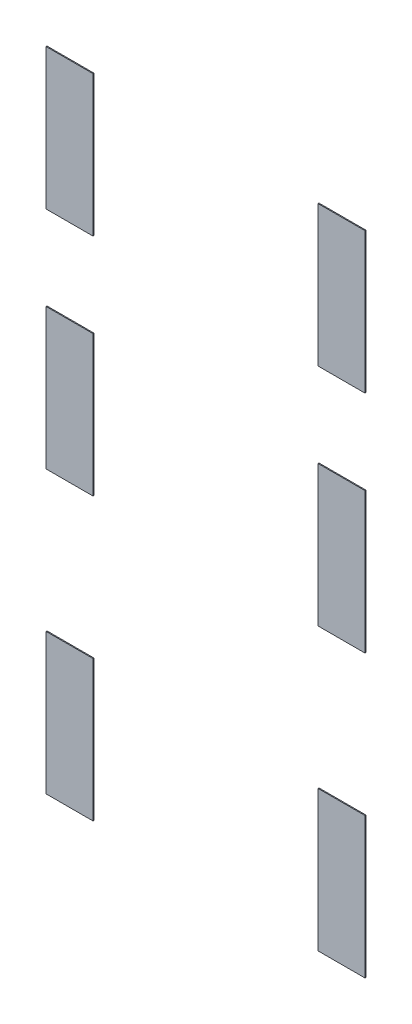
ISO-10303-21;
HEADER;
FILE_DESCRIPTION(('STEP AP214'),'2;1');
FILE_NAME('part.step','',(''),(''),'','','');
FILE_SCHEMA(('AUTOMOTIVE_DESIGN { 1 0 10303 214 1 1 1 1 }'));
ENDSEC;
DATA;
#1=APPLICATION_CONTEXT('core data for automotive mechanical design processes');
#2=APPLICATION_PROTOCOL_DEFINITION('international standard','automotive_design',2000,#1);
#3=PRODUCT_CONTEXT('',#1,'mechanical');
#4=PRODUCT('Part','Part','',(#3));
#5=PRODUCT_RELATED_PRODUCT_CATEGORY('part','',(#4));
#6=PRODUCT_DEFINITION_FORMATION('','',#4);
#7=PRODUCT_DEFINITION_CONTEXT('part definition',#1,'design');
#8=PRODUCT_DEFINITION('design','',#6,#7);
#9=PRODUCT_DEFINITION_SHAPE('','',#8);
#10=(LENGTH_UNIT() NAMED_UNIT(*) SI_UNIT(.MILLI.,.METRE.));
#11=(NAMED_UNIT(*) PLANE_ANGLE_UNIT() SI_UNIT($,.RADIAN.));
#12=(NAMED_UNIT(*) SI_UNIT($,.STERADIAN.) SOLID_ANGLE_UNIT());
#13=UNCERTAINTY_MEASURE_WITH_UNIT(LENGTH_MEASURE(1.E-05),#10,'distance_accuracy_value','');
#14=(GEOMETRIC_REPRESENTATION_CONTEXT(3) GLOBAL_UNCERTAINTY_ASSIGNED_CONTEXT((#13)) GLOBAL_UNIT_ASSIGNED_CONTEXT((#10,
#11,#12)) REPRESENTATION_CONTEXT('',''));
#15=CARTESIAN_POINT('',(0.,0.,0.));
#16=DIRECTION('',(0.,0.,1.));
#17=DIRECTION('',(1.,0.,0.));
#18=AXIS2_PLACEMENT_3D('',#15,#16,#17);
#19=CARTESIAN_POINT('',(241.29,-203.2,-0.01));
#20=DIRECTION('',(0.,-1.,0.));
#21=DIRECTION('',(1.,0.,0.));
#22=AXIS2_PLACEMENT_3D('',#19,#20,#21);
#23=PLANE('',#22);
#24=DIRECTION('',(1.,0.,0.));
#25=VECTOR('',#24,1.);
#26=CARTESIAN_POINT('',(304.8,-203.2,2.54));
#27=LINE('',#26,#25);
#28=CARTESIAN_POINT('',(241.3,-203.2,2.54));
#29=VERTEX_POINT('',#28);
#30=CARTESIAN_POINT('',(368.3,-203.2,2.54));
#31=VERTEX_POINT('',#30);
#32=EDGE_CURVE('P0_E69',#29,#31,#27,.T.);
#33=ORIENTED_EDGE('',*,*,#32,.F.);
#34=DIRECTION('',(0.,0.,1.));
#35=VECTOR('',#34,1.);
#36=CARTESIAN_POINT('',(241.3,-203.2,1.27000000000001));
#37=LINE('',#36,#35);
#38=CARTESIAN_POINT('',(241.3,-203.2,0.));
#39=VERTEX_POINT('',#38);
#40=EDGE_CURVE('P0_E56',#39,#29,#37,.T.);
#41=ORIENTED_EDGE('',*,*,#40,.F.);
#42=DIRECTION('',(-1.,0.,0.));
#43=VECTOR('',#42,1.);
#44=CARTESIAN_POINT('',(304.8,-203.2,0.));
#45=LINE('',#44,#43);
#46=CARTESIAN_POINT('',(368.3,-203.2,0.));
#47=VERTEX_POINT('',#46);
#48=EDGE_CURVE('P0_E21',#47,#39,#45,.T.);
#49=ORIENTED_EDGE('',*,*,#48,.F.);
#50=DIRECTION('',(0.,0.,-1.));
#51=VECTOR('',#50,1.);
#52=CARTESIAN_POINT('',(368.3,-203.2,1.27000000000001));
#53=LINE('',#52,#51);
#54=EDGE_CURVE('P0_E82',#31,#47,#53,.T.);
#55=ORIENTED_EDGE('',*,*,#54,.F.);
#56=EDGE_LOOP('',(#33,#41,#49,#55));
#57=FACE_BOUND('',#56,.T.);
#58=ADVANCED_FACE('P0_F17',(#57),#23,.T.);
#59=CARTESIAN_POINT('',(368.31,-203.21,0.));
#60=DIRECTION('',(0.,0.,-1.));
#61=DIRECTION('',(-1.,0.,0.));
#62=AXIS2_PLACEMENT_3D('',#59,#60,#61);
#63=PLANE('',#62);
#64=DIRECTION('',(0.,1.,0.));
#65=VECTOR('',#64,1.);
#66=CARTESIAN_POINT('',(368.3,-12.7,0.));
#67=LINE('',#66,#65);
#68=CARTESIAN_POINT('',(368.3,177.8,0.));
#69=VERTEX_POINT('',#68);
#70=EDGE_CURVE('P0_E65',#47,#69,#67,.T.);
#71=ORIENTED_EDGE('',*,*,#70,.F.);
#72=ORIENTED_EDGE('',*,*,#48,.T.);
#73=DIRECTION('',(0.,-1.,0.));
#74=VECTOR('',#73,1.);
#75=CARTESIAN_POINT('',(241.3,-12.7,0.));
#76=LINE('',#75,#74);
#77=CARTESIAN_POINT('',(241.3,177.8,0.));
#78=VERTEX_POINT('',#77);
#79=EDGE_CURVE('P0_E62',#78,#39,#76,.T.);
#80=ORIENTED_EDGE('',*,*,#79,.F.);
#81=DIRECTION('',(-1.,0.,0.));
#82=VECTOR('',#81,1.);
#83=CARTESIAN_POINT('',(304.8,177.8,0.));
#84=LINE('',#83,#82);
#85=EDGE_CURVE('P0_E84',#69,#78,#84,.T.);
#86=ORIENTED_EDGE('',*,*,#85,.F.);
#87=EDGE_LOOP('',(#71,#72,#80,#86));
#88=FACE_BOUND('',#87,.T.);
#89=ADVANCED_FACE('P0_F61',(#88),#63,.T.);
#90=CARTESIAN_POINT('',(241.3,177.81,-0.01));
#91=DIRECTION('',(-1.,0.,0.));
#92=DIRECTION('',(0.,-1.,0.));
#93=AXIS2_PLACEMENT_3D('',#90,#91,#92);
#94=PLANE('',#93);
#95=DIRECTION('',(0.,-1.,0.));
#96=VECTOR('',#95,1.);
#97=CARTESIAN_POINT('',(241.3,-12.7,2.54));
#98=LINE('',#97,#96);
#99=CARTESIAN_POINT('',(241.3,177.8,2.54));
#100=VERTEX_POINT('',#99);
#101=EDGE_CURVE('P0_E71',#100,#29,#98,.T.);
#102=ORIENTED_EDGE('',*,*,#101,.F.);
#103=DIRECTION('',(0.,0.,1.));
#104=VECTOR('',#103,1.);
#105=CARTESIAN_POINT('',(241.3,177.8,1.27000000000001));
#106=LINE('',#105,#104);
#107=EDGE_CURVE('P0_E75',#78,#100,#106,.T.);
#108=ORIENTED_EDGE('',*,*,#107,.F.);
#109=ORIENTED_EDGE('',*,*,#79,.T.);
#110=ORIENTED_EDGE('',*,*,#40,.T.);
#111=EDGE_LOOP('',(#102,#108,#109,#110));
#112=FACE_BOUND('',#111,.T.);
#113=ADVANCED_FACE('P0_F73',(#112),#94,.T.);
#114=CARTESIAN_POINT('',(241.29,-203.21,2.54));
#115=DIRECTION('',(0.,0.,1.));
#116=DIRECTION('',(1.,0.,0.));
#117=AXIS2_PLACEMENT_3D('',#114,#115,#116);
#118=PLANE('',#117);
#119=DIRECTION('',(0.,-1.,0.));
#120=VECTOR('',#119,1.);
#121=CARTESIAN_POINT('',(368.3,-12.7,2.54));
#122=LINE('',#121,#120);
#123=CARTESIAN_POINT('',(368.3,177.8,2.54));
#124=VERTEX_POINT('',#123);
#125=EDGE_CURVE('P0_E36',#124,#31,#122,.T.);
#126=ORIENTED_EDGE('',*,*,#125,.F.);
#127=DIRECTION('',(1.,0.,0.));
#128=VECTOR('',#127,1.);
#129=CARTESIAN_POINT('',(304.8,177.8,2.54));
#130=LINE('',#129,#128);
#131=EDGE_CURVE('P0_E27',#100,#124,#130,.T.);
#132=ORIENTED_EDGE('',*,*,#131,.F.);
#133=ORIENTED_EDGE('',*,*,#101,.T.);
#134=ORIENTED_EDGE('',*,*,#32,.T.);
#135=EDGE_LOOP('',(#126,#132,#133,#134));
#136=FACE_BOUND('',#135,.T.);
#137=ADVANCED_FACE('P0_F89',(#136),#118,.T.);
#138=CARTESIAN_POINT('',(368.3,-203.21,-0.01));
#139=DIRECTION('',(1.,0.,0.));
#140=DIRECTION('',(0.,1.,0.));
#141=AXIS2_PLACEMENT_3D('',#138,#139,#140);
#142=PLANE('',#141);
#143=ORIENTED_EDGE('',*,*,#125,.T.);
#144=ORIENTED_EDGE('',*,*,#54,.T.);
#145=ORIENTED_EDGE('',*,*,#70,.T.);
#146=DIRECTION('',(0.,0.,-1.));
#147=VECTOR('',#146,1.);
#148=CARTESIAN_POINT('',(368.3,177.8,1.27000000000001));
#149=LINE('',#148,#147);
#150=EDGE_CURVE('P0_E11',#124,#69,#149,.T.);
#151=ORIENTED_EDGE('',*,*,#150,.F.);
#152=EDGE_LOOP('',(#143,#144,#145,#151));
#153=FACE_BOUND('',#152,.T.);
#154=ADVANCED_FACE('P0_F91',(#153),#142,.T.);
#155=CARTESIAN_POINT('',(368.31,177.8,-0.01));
#156=DIRECTION('',(0.,1.,0.));
#157=DIRECTION('',(-1.,0.,0.));
#158=AXIS2_PLACEMENT_3D('',#155,#156,#157);
#159=PLANE('',#158);
#160=ORIENTED_EDGE('',*,*,#131,.T.);
#161=ORIENTED_EDGE('',*,*,#150,.T.);
#162=ORIENTED_EDGE('',*,*,#85,.T.);
#163=ORIENTED_EDGE('',*,*,#107,.T.);
#164=EDGE_LOOP('',(#160,#161,#162,#163));
#165=FACE_BOUND('',#164,.T.);
#166=ADVANCED_FACE('P0_F19',(#165),#159,.T.);
#167=CLOSED_SHELL('',(#58,#89,#113,#137,#154,#166));
#168=MANIFOLD_SOLID_BREP('P0_B1',#167);
#169=CARTESIAN_POINT('',(-495.3,177.81,-0.01));
#170=DIRECTION('',(-1.,0.,0.));
#171=DIRECTION('',(0.,-1.,0.));
#172=AXIS2_PLACEMENT_3D('',#169,#170,#171);
#173=PLANE('',#172);
#174=DIRECTION('',(0.,-1.,0.));
#175=VECTOR('',#174,1.);
#176=CARTESIAN_POINT('',(-495.3,-12.7000000000002,2.54));
#177=LINE('',#176,#175);
#178=CARTESIAN_POINT('',(-495.3,177.8,2.54));
#179=VERTEX_POINT('',#178);
#180=CARTESIAN_POINT('',(-495.3,-203.2,2.54));
#181=VERTEX_POINT('',#180);
#182=EDGE_CURVE('P1_E69',#179,#181,#177,.T.);
#183=ORIENTED_EDGE('',*,*,#182,.F.);
#184=DIRECTION('',(0.,0.,1.));
#185=VECTOR('',#184,1.);
#186=CARTESIAN_POINT('',(-495.3,177.8,1.27000000000001));
#187=LINE('',#186,#185);
#188=CARTESIAN_POINT('',(-495.3,177.8,0.));
#189=VERTEX_POINT('',#188);
#190=EDGE_CURVE('P1_E56',#189,#179,#187,.T.);
#191=ORIENTED_EDGE('',*,*,#190,.F.);
#192=DIRECTION('',(0.,1.,0.));
#193=VECTOR('',#192,1.);
#194=CARTESIAN_POINT('',(-495.3,-12.7000000000002,0.));
#195=LINE('',#194,#193);
#196=CARTESIAN_POINT('',(-495.3,-203.2,0.));
#197=VERTEX_POINT('',#196);
#198=EDGE_CURVE('P1_E21',#197,#189,#195,.T.);
#199=ORIENTED_EDGE('',*,*,#198,.F.);
#200=DIRECTION('',(0.,0.,-1.));
#201=VECTOR('',#200,1.);
#202=CARTESIAN_POINT('',(-495.3,-203.2,1.27000000000001));
#203=LINE('',#202,#201);
#204=EDGE_CURVE('P1_E82',#181,#197,#203,.T.);
#205=ORIENTED_EDGE('',*,*,#204,.F.);
#206=EDGE_LOOP('',(#183,#191,#199,#205));
#207=FACE_BOUND('',#206,.T.);
#208=ADVANCED_FACE('P1_F17',(#207),#173,.T.);
#209=CARTESIAN_POINT('',(-368.29,-203.21,0.));
#210=DIRECTION('',(0.,0.,-1.));
#211=DIRECTION('',(-1.,0.,0.));
#212=AXIS2_PLACEMENT_3D('',#209,#210,#211);
#213=PLANE('',#212);
#214=DIRECTION('',(1.,0.,0.));
#215=VECTOR('',#214,1.);
#216=CARTESIAN_POINT('',(-431.8,-203.2,0.));
#217=LINE('',#216,#215);
#218=CARTESIAN_POINT('',(-368.3,-203.2,0.));
#219=VERTEX_POINT('',#218);
#220=EDGE_CURVE('P1_E65',#197,#219,#217,.T.);
#221=ORIENTED_EDGE('',*,*,#220,.F.);
#222=ORIENTED_EDGE('',*,*,#198,.T.);
#223=DIRECTION('',(-1.,0.,0.));
#224=VECTOR('',#223,1.);
#225=CARTESIAN_POINT('',(-431.8,177.8,0.));
#226=LINE('',#225,#224);
#227=CARTESIAN_POINT('',(-368.3,177.8,0.));
#228=VERTEX_POINT('',#227);
#229=EDGE_CURVE('P1_E62',#228,#189,#226,.T.);
#230=ORIENTED_EDGE('',*,*,#229,.F.);
#231=DIRECTION('',(0.,1.,0.));
#232=VECTOR('',#231,1.);
#233=CARTESIAN_POINT('',(-368.3,-12.7000000000002,0.));
#234=LINE('',#233,#232);
#235=EDGE_CURVE('P1_E84',#219,#228,#234,.T.);
#236=ORIENTED_EDGE('',*,*,#235,.F.);
#237=EDGE_LOOP('',(#221,#222,#230,#236));
#238=FACE_BOUND('',#237,.T.);
#239=ADVANCED_FACE('P1_F61',(#238),#213,.T.);
#240=CARTESIAN_POINT('',(-368.29,177.8,-0.01));
#241=DIRECTION('',(0.,1.,0.));
#242=DIRECTION('',(-1.,0.,0.));
#243=AXIS2_PLACEMENT_3D('',#240,#241,#242);
#244=PLANE('',#243);
#245=DIRECTION('',(-1.,0.,0.));
#246=VECTOR('',#245,1.);
#247=CARTESIAN_POINT('',(-431.8,177.8,2.54));
#248=LINE('',#247,#246);
#249=CARTESIAN_POINT('',(-368.3,177.8,2.54));
#250=VERTEX_POINT('',#249);
#251=EDGE_CURVE('P1_E71',#250,#179,#248,.T.);
#252=ORIENTED_EDGE('',*,*,#251,.F.);
#253=DIRECTION('',(0.,0.,1.));
#254=VECTOR('',#253,1.);
#255=CARTESIAN_POINT('',(-368.3,177.8,1.27000000000001));
#256=LINE('',#255,#254);
#257=EDGE_CURVE('P1_E75',#228,#250,#256,.T.);
#258=ORIENTED_EDGE('',*,*,#257,.F.);
#259=ORIENTED_EDGE('',*,*,#229,.T.);
#260=ORIENTED_EDGE('',*,*,#190,.T.);
#261=EDGE_LOOP('',(#252,#258,#259,#260));
#262=FACE_BOUND('',#261,.T.);
#263=ADVANCED_FACE('P1_F73',(#262),#244,.T.);
#264=CARTESIAN_POINT('',(-495.31,-203.21,2.54));
#265=DIRECTION('',(0.,0.,1.));
#266=DIRECTION('',(1.,0.,0.));
#267=AXIS2_PLACEMENT_3D('',#264,#265,#266);
#268=PLANE('',#267);
#269=DIRECTION('',(-1.,0.,0.));
#270=VECTOR('',#269,1.);
#271=CARTESIAN_POINT('',(-431.8,-203.2,2.54));
#272=LINE('',#271,#270);
#273=CARTESIAN_POINT('',(-368.3,-203.2,2.54));
#274=VERTEX_POINT('',#273);
#275=EDGE_CURVE('P1_E36',#274,#181,#272,.T.);
#276=ORIENTED_EDGE('',*,*,#275,.F.);
#277=DIRECTION('',(0.,-1.,0.));
#278=VECTOR('',#277,1.);
#279=CARTESIAN_POINT('',(-368.3,-12.7000000000002,2.54));
#280=LINE('',#279,#278);
#281=EDGE_CURVE('P1_E27',#250,#274,#280,.T.);
#282=ORIENTED_EDGE('',*,*,#281,.F.);
#283=ORIENTED_EDGE('',*,*,#251,.T.);
#284=ORIENTED_EDGE('',*,*,#182,.T.);
#285=EDGE_LOOP('',(#276,#282,#283,#284));
#286=FACE_BOUND('',#285,.T.);
#287=ADVANCED_FACE('P1_F89',(#286),#268,.T.);
#288=CARTESIAN_POINT('',(-495.31,-203.2,-0.01));
#289=DIRECTION('',(0.,-1.,0.));
#290=DIRECTION('',(1.,0.,0.));
#291=AXIS2_PLACEMENT_3D('',#288,#289,#290);
#292=PLANE('',#291);
#293=ORIENTED_EDGE('',*,*,#275,.T.);
#294=ORIENTED_EDGE('',*,*,#204,.T.);
#295=ORIENTED_EDGE('',*,*,#220,.T.);
#296=DIRECTION('',(0.,0.,-1.));
#297=VECTOR('',#296,1.);
#298=CARTESIAN_POINT('',(-368.3,-203.2,1.27000000000001));
#299=LINE('',#298,#297);
#300=EDGE_CURVE('P1_E11',#274,#219,#299,.T.);
#301=ORIENTED_EDGE('',*,*,#300,.F.);
#302=EDGE_LOOP('',(#293,#294,#295,#301));
#303=FACE_BOUND('',#302,.T.);
#304=ADVANCED_FACE('P1_F91',(#303),#292,.T.);
#305=CARTESIAN_POINT('',(-368.3,-203.21,-0.01));
#306=DIRECTION('',(1.,0.,0.));
#307=DIRECTION('',(0.,1.,0.));
#308=AXIS2_PLACEMENT_3D('',#305,#306,#307);
#309=PLANE('',#308);
#310=ORIENTED_EDGE('',*,*,#281,.T.);
#311=ORIENTED_EDGE('',*,*,#300,.T.);
#312=ORIENTED_EDGE('',*,*,#235,.T.);
#313=ORIENTED_EDGE('',*,*,#257,.T.);
#314=EDGE_LOOP('',(#310,#311,#312,#313));
#315=FACE_BOUND('',#314,.T.);
#316=ADVANCED_FACE('P1_F19',(#315),#309,.T.);
#317=CLOSED_SHELL('',(#208,#239,#263,#287,#304,#316));
#318=MANIFOLD_SOLID_BREP('P1_B1',#317);
#319=CARTESIAN_POINT('',(241.29,-965.2,-0.01));
#320=DIRECTION('',(0.,-1.,0.));
#321=DIRECTION('',(1.,0.,0.));
#322=AXIS2_PLACEMENT_3D('',#319,#320,#321);
#323=PLANE('',#322);
#324=DIRECTION('',(1.,0.,0.));
#325=VECTOR('',#324,1.);
#326=CARTESIAN_POINT('',(304.8,-965.2,2.54));
#327=LINE('',#326,#325);
#328=CARTESIAN_POINT('',(241.3,-965.2,2.54));
#329=VERTEX_POINT('',#328);
#330=CARTESIAN_POINT('',(368.3,-965.2,2.54));
#331=VERTEX_POINT('',#330);
#332=EDGE_CURVE('P2_E69',#329,#331,#327,.T.);
#333=ORIENTED_EDGE('',*,*,#332,.F.);
#334=DIRECTION('',(0.,0.,1.));
#335=VECTOR('',#334,1.);
#336=CARTESIAN_POINT('',(241.3,-965.2,1.27000000000001));
#337=LINE('',#336,#335);
#338=CARTESIAN_POINT('',(241.3,-965.2,0.));
#339=VERTEX_POINT('',#338);
#340=EDGE_CURVE('P2_E56',#339,#329,#337,.T.);
#341=ORIENTED_EDGE('',*,*,#340,.F.);
#342=DIRECTION('',(-1.,0.,0.));
#343=VECTOR('',#342,1.);
#344=CARTESIAN_POINT('',(304.8,-965.2,0.));
#345=LINE('',#344,#343);
#346=CARTESIAN_POINT('',(368.3,-965.2,0.));
#347=VERTEX_POINT('',#346);
#348=EDGE_CURVE('P2_E21',#347,#339,#345,.T.);
#349=ORIENTED_EDGE('',*,*,#348,.F.);
#350=DIRECTION('',(0.,0.,-1.));
#351=VECTOR('',#350,1.);
#352=CARTESIAN_POINT('',(368.3,-965.2,1.27000000000001));
#353=LINE('',#352,#351);
#354=EDGE_CURVE('P2_E82',#331,#347,#353,.T.);
#355=ORIENTED_EDGE('',*,*,#354,.F.);
#356=EDGE_LOOP('',(#333,#341,#349,#355));
#357=FACE_BOUND('',#356,.T.);
#358=ADVANCED_FACE('P2_F17',(#357),#323,.T.);
#359=CARTESIAN_POINT('',(368.31,-965.21,0.));
#360=DIRECTION('',(0.,0.,-1.));
#361=DIRECTION('',(-1.,0.,0.));
#362=AXIS2_PLACEMENT_3D('',#359,#360,#361);
#363=PLANE('',#362);
#364=DIRECTION('',(0.,1.,0.));
#365=VECTOR('',#364,1.);
#366=CARTESIAN_POINT('',(368.3,-774.7,0.));
#367=LINE('',#366,#365);
#368=CARTESIAN_POINT('',(368.3,-584.2,0.));
#369=VERTEX_POINT('',#368);
#370=EDGE_CURVE('P2_E65',#347,#369,#367,.T.);
#371=ORIENTED_EDGE('',*,*,#370,.F.);
#372=ORIENTED_EDGE('',*,*,#348,.T.);
#373=DIRECTION('',(0.,-1.,0.));
#374=VECTOR('',#373,1.);
#375=CARTESIAN_POINT('',(241.3,-774.7,0.));
#376=LINE('',#375,#374);
#377=CARTESIAN_POINT('',(241.3,-584.2,0.));
#378=VERTEX_POINT('',#377);
#379=EDGE_CURVE('P2_E62',#378,#339,#376,.T.);
#380=ORIENTED_EDGE('',*,*,#379,.F.);
#381=DIRECTION('',(-1.,0.,0.));
#382=VECTOR('',#381,1.);
#383=CARTESIAN_POINT('',(304.8,-584.2,0.));
#384=LINE('',#383,#382);
#385=EDGE_CURVE('P2_E84',#369,#378,#384,.T.);
#386=ORIENTED_EDGE('',*,*,#385,.F.);
#387=EDGE_LOOP('',(#371,#372,#380,#386));
#388=FACE_BOUND('',#387,.T.);
#389=ADVANCED_FACE('P2_F61',(#388),#363,.T.);
#390=CARTESIAN_POINT('',(241.3,-584.19,-0.01));
#391=DIRECTION('',(-1.,0.,0.));
#392=DIRECTION('',(0.,-1.,0.));
#393=AXIS2_PLACEMENT_3D('',#390,#391,#392);
#394=PLANE('',#393);
#395=DIRECTION('',(0.,-1.,0.));
#396=VECTOR('',#395,1.);
#397=CARTESIAN_POINT('',(241.3,-774.7,2.54));
#398=LINE('',#397,#396);
#399=CARTESIAN_POINT('',(241.3,-584.2,2.54));
#400=VERTEX_POINT('',#399);
#401=EDGE_CURVE('P2_E71',#400,#329,#398,.T.);
#402=ORIENTED_EDGE('',*,*,#401,.F.);
#403=DIRECTION('',(0.,0.,1.));
#404=VECTOR('',#403,1.);
#405=CARTESIAN_POINT('',(241.3,-584.2,1.27000000000001));
#406=LINE('',#405,#404);
#407=EDGE_CURVE('P2_E75',#378,#400,#406,.T.);
#408=ORIENTED_EDGE('',*,*,#407,.F.);
#409=ORIENTED_EDGE('',*,*,#379,.T.);
#410=ORIENTED_EDGE('',*,*,#340,.T.);
#411=EDGE_LOOP('',(#402,#408,#409,#410));
#412=FACE_BOUND('',#411,.T.);
#413=ADVANCED_FACE('P2_F73',(#412),#394,.T.);
#414=CARTESIAN_POINT('',(241.29,-965.21,2.54));
#415=DIRECTION('',(0.,0.,1.));
#416=DIRECTION('',(1.,0.,0.));
#417=AXIS2_PLACEMENT_3D('',#414,#415,#416);
#418=PLANE('',#417);
#419=DIRECTION('',(0.,-1.,0.));
#420=VECTOR('',#419,1.);
#421=CARTESIAN_POINT('',(368.3,-774.7,2.54));
#422=LINE('',#421,#420);
#423=CARTESIAN_POINT('',(368.3,-584.2,2.54));
#424=VERTEX_POINT('',#423);
#425=EDGE_CURVE('P2_E36',#424,#331,#422,.T.);
#426=ORIENTED_EDGE('',*,*,#425,.F.);
#427=DIRECTION('',(1.,0.,0.));
#428=VECTOR('',#427,1.);
#429=CARTESIAN_POINT('',(304.8,-584.2,2.54));
#430=LINE('',#429,#428);
#431=EDGE_CURVE('P2_E27',#400,#424,#430,.T.);
#432=ORIENTED_EDGE('',*,*,#431,.F.);
#433=ORIENTED_EDGE('',*,*,#401,.T.);
#434=ORIENTED_EDGE('',*,*,#332,.T.);
#435=EDGE_LOOP('',(#426,#432,#433,#434));
#436=FACE_BOUND('',#435,.T.);
#437=ADVANCED_FACE('P2_F89',(#436),#418,.T.);
#438=CARTESIAN_POINT('',(368.3,-965.21,-0.01));
#439=DIRECTION('',(1.,0.,0.));
#440=DIRECTION('',(0.,1.,0.));
#441=AXIS2_PLACEMENT_3D('',#438,#439,#440);
#442=PLANE('',#441);
#443=ORIENTED_EDGE('',*,*,#425,.T.);
#444=ORIENTED_EDGE('',*,*,#354,.T.);
#445=ORIENTED_EDGE('',*,*,#370,.T.);
#446=DIRECTION('',(0.,0.,-1.));
#447=VECTOR('',#446,1.);
#448=CARTESIAN_POINT('',(368.3,-584.2,1.27000000000001));
#449=LINE('',#448,#447);
#450=EDGE_CURVE('P2_E11',#424,#369,#449,.T.);
#451=ORIENTED_EDGE('',*,*,#450,.F.);
#452=EDGE_LOOP('',(#443,#444,#445,#451));
#453=FACE_BOUND('',#452,.T.);
#454=ADVANCED_FACE('P2_F91',(#453),#442,.T.);
#455=CARTESIAN_POINT('',(368.31,-584.2,-0.01));
#456=DIRECTION('',(0.,1.,0.));
#457=DIRECTION('',(-1.,0.,0.));
#458=AXIS2_PLACEMENT_3D('',#455,#456,#457);
#459=PLANE('',#458);
#460=ORIENTED_EDGE('',*,*,#431,.T.);
#461=ORIENTED_EDGE('',*,*,#450,.T.);
#462=ORIENTED_EDGE('',*,*,#385,.T.);
#463=ORIENTED_EDGE('',*,*,#407,.T.);
#464=EDGE_LOOP('',(#460,#461,#462,#463));
#465=FACE_BOUND('',#464,.T.);
#466=ADVANCED_FACE('P2_F19',(#465),#459,.T.);
#467=CLOSED_SHELL('',(#358,#389,#413,#437,#454,#466));
#468=MANIFOLD_SOLID_BREP('P2_B1',#467);
#469=CARTESIAN_POINT('',(241.29,406.4,-0.01));
#470=DIRECTION('',(0.,-1.,0.));
#471=DIRECTION('',(1.,0.,0.));
#472=AXIS2_PLACEMENT_3D('',#469,#470,#471);
#473=PLANE('',#472);
#474=DIRECTION('',(1.,0.,0.));
#475=VECTOR('',#474,1.);
#476=CARTESIAN_POINT('',(304.8,406.4,2.54));
#477=LINE('',#476,#475);
#478=CARTESIAN_POINT('',(241.3,406.4,2.54));
#479=VERTEX_POINT('',#478);
#480=CARTESIAN_POINT('',(368.3,406.4,2.54));
#481=VERTEX_POINT('',#480);
#482=EDGE_CURVE('P3_E68',#479,#481,#477,.T.);
#483=ORIENTED_EDGE('',*,*,#482,.F.);
#484=DIRECTION('',(0.,0.,1.));
#485=VECTOR('',#484,1.);
#486=CARTESIAN_POINT('',(241.3,406.4,1.27000000000001));
#487=LINE('',#486,#485);
#488=CARTESIAN_POINT('',(241.3,406.4,0.));
#489=VERTEX_POINT('',#488);
#490=EDGE_CURVE('P3_E55',#489,#479,#487,.T.);
#491=ORIENTED_EDGE('',*,*,#490,.F.);
#492=DIRECTION('',(-1.,0.,0.));
#493=VECTOR('',#492,1.);
#494=CARTESIAN_POINT('',(304.8,406.4,0.));
#495=LINE('',#494,#493);
#496=CARTESIAN_POINT('',(368.3,406.4,0.));
#497=VERTEX_POINT('',#496);
#498=EDGE_CURVE('P3_E20',#497,#489,#495,.T.);
#499=ORIENTED_EDGE('',*,*,#498,.F.);
#500=DIRECTION('',(0.,0.,-1.));
#501=VECTOR('',#500,1.);
#502=CARTESIAN_POINT('',(368.3,406.4,1.27000000000001));
#503=LINE('',#502,#501);
#504=EDGE_CURVE('P3_E81',#481,#497,#503,.T.);
#505=ORIENTED_EDGE('',*,*,#504,.F.);
#506=EDGE_LOOP('',(#483,#491,#499,#505));
#507=FACE_BOUND('',#506,.T.);
#508=ADVANCED_FACE('P3_F16',(#507),#473,.T.);
#509=CARTESIAN_POINT('',(368.31,406.39,0.));
#510=DIRECTION('',(0.,0.,-1.));
#511=DIRECTION('',(-1.,0.,0.));
#512=AXIS2_PLACEMENT_3D('',#509,#510,#511);
#513=PLANE('',#512);
#514=DIRECTION('',(0.,1.,0.));
#515=VECTOR('',#514,1.);
#516=CARTESIAN_POINT('',(368.3,596.9,0.));
#517=LINE('',#516,#515);
#518=CARTESIAN_POINT('',(368.3,787.4,0.));
#519=VERTEX_POINT('',#518);
#520=EDGE_CURVE('P3_E64',#497,#519,#517,.T.);
#521=ORIENTED_EDGE('',*,*,#520,.F.);
#522=ORIENTED_EDGE('',*,*,#498,.T.);
#523=DIRECTION('',(0.,-1.,0.));
#524=VECTOR('',#523,1.);
#525=CARTESIAN_POINT('',(241.3,596.9,0.));
#526=LINE('',#525,#524);
#527=CARTESIAN_POINT('',(241.3,787.4,0.));
#528=VERTEX_POINT('',#527);
#529=EDGE_CURVE('P3_E61',#528,#489,#526,.T.);
#530=ORIENTED_EDGE('',*,*,#529,.F.);
#531=DIRECTION('',(-1.,0.,0.));
#532=VECTOR('',#531,1.);
#533=CARTESIAN_POINT('',(304.8,787.4,0.));
#534=LINE('',#533,#532);
#535=EDGE_CURVE('P3_E83',#519,#528,#534,.T.);
#536=ORIENTED_EDGE('',*,*,#535,.F.);
#537=EDGE_LOOP('',(#521,#522,#530,#536));
#538=FACE_BOUND('',#537,.T.);
#539=ADVANCED_FACE('P3_F60',(#538),#513,.T.);
#540=CARTESIAN_POINT('',(241.3,787.41,-0.01));
#541=DIRECTION('',(-1.,0.,0.));
#542=DIRECTION('',(0.,-1.,0.));
#543=AXIS2_PLACEMENT_3D('',#540,#541,#542);
#544=PLANE('',#543);
#545=DIRECTION('',(0.,-1.,0.));
#546=VECTOR('',#545,1.);
#547=CARTESIAN_POINT('',(241.3,596.9,2.54));
#548=LINE('',#547,#546);
#549=CARTESIAN_POINT('',(241.3,787.4,2.54));
#550=VERTEX_POINT('',#549);
#551=EDGE_CURVE('P3_E70',#550,#479,#548,.T.);
#552=ORIENTED_EDGE('',*,*,#551,.F.);
#553=DIRECTION('',(0.,0.,1.));
#554=VECTOR('',#553,1.);
#555=CARTESIAN_POINT('',(241.3,787.4,1.27000000000001));
#556=LINE('',#555,#554);
#557=EDGE_CURVE('P3_E74',#528,#550,#556,.T.);
#558=ORIENTED_EDGE('',*,*,#557,.F.);
#559=ORIENTED_EDGE('',*,*,#529,.T.);
#560=ORIENTED_EDGE('',*,*,#490,.T.);
#561=EDGE_LOOP('',(#552,#558,#559,#560));
#562=FACE_BOUND('',#561,.T.);
#563=ADVANCED_FACE('P3_F72',(#562),#544,.T.);
#564=CARTESIAN_POINT('',(241.29,406.39,2.54));
#565=DIRECTION('',(0.,0.,1.));
#566=DIRECTION('',(1.,0.,0.));
#567=AXIS2_PLACEMENT_3D('',#564,#565,#566);
#568=PLANE('',#567);
#569=DIRECTION('',(0.,-1.,0.));
#570=VECTOR('',#569,1.);
#571=CARTESIAN_POINT('',(368.3,596.9,2.54));
#572=LINE('',#571,#570);
#573=CARTESIAN_POINT('',(368.3,787.4,2.54));
#574=VERTEX_POINT('',#573);
#575=EDGE_CURVE('P3_E35',#574,#481,#572,.T.);
#576=ORIENTED_EDGE('',*,*,#575,.F.);
#577=DIRECTION('',(1.,0.,0.));
#578=VECTOR('',#577,1.);
#579=CARTESIAN_POINT('',(304.8,787.4,2.54));
#580=LINE('',#579,#578);
#581=EDGE_CURVE('P3_E26',#550,#574,#580,.T.);
#582=ORIENTED_EDGE('',*,*,#581,.F.);
#583=ORIENTED_EDGE('',*,*,#551,.T.);
#584=ORIENTED_EDGE('',*,*,#482,.T.);
#585=EDGE_LOOP('',(#576,#582,#583,#584));
#586=FACE_BOUND('',#585,.T.);
#587=ADVANCED_FACE('P3_F88',(#586),#568,.T.);
#588=CARTESIAN_POINT('',(368.3,406.39,-0.01));
#589=DIRECTION('',(1.,0.,0.));
#590=DIRECTION('',(0.,1.,0.));
#591=AXIS2_PLACEMENT_3D('',#588,#589,#590);
#592=PLANE('',#591);
#593=ORIENTED_EDGE('',*,*,#575,.T.);
#594=ORIENTED_EDGE('',*,*,#504,.T.);
#595=ORIENTED_EDGE('',*,*,#520,.T.);
#596=DIRECTION('',(0.,0.,-1.));
#597=VECTOR('',#596,1.);
#598=CARTESIAN_POINT('',(368.3,787.4,1.27000000000001));
#599=LINE('',#598,#597);
#600=EDGE_CURVE('P3_E10',#574,#519,#599,.T.);
#601=ORIENTED_EDGE('',*,*,#600,.F.);
#602=EDGE_LOOP('',(#593,#594,#595,#601));
#603=FACE_BOUND('',#602,.T.);
#604=ADVANCED_FACE('P3_F90',(#603),#592,.T.);
#605=CARTESIAN_POINT('',(368.31,787.4,-0.01));
#606=DIRECTION('',(0.,1.,0.));
#607=DIRECTION('',(-1.,0.,0.));
#608=AXIS2_PLACEMENT_3D('',#605,#606,#607);
#609=PLANE('',#608);
#610=ORIENTED_EDGE('',*,*,#581,.T.);
#611=ORIENTED_EDGE('',*,*,#600,.T.);
#612=ORIENTED_EDGE('',*,*,#535,.T.);
#613=ORIENTED_EDGE('',*,*,#557,.T.);
#614=EDGE_LOOP('',(#610,#611,#612,#613));
#615=FACE_BOUND('',#614,.T.);
#616=ADVANCED_FACE('P3_F18',(#615),#609,.T.);
#617=CLOSED_SHELL('',(#508,#539,#563,#587,#604,#616));
#618=MANIFOLD_SOLID_BREP('P3_B1',#617);
#619=CARTESIAN_POINT('',(-495.3,787.41,-0.01));
#620=DIRECTION('',(-1.,0.,0.));
#621=DIRECTION('',(0.,-1.,0.));
#622=AXIS2_PLACEMENT_3D('',#619,#620,#621);
#623=PLANE('',#622);
#624=DIRECTION('',(0.,-1.,0.));
#625=VECTOR('',#624,1.);
#626=CARTESIAN_POINT('',(-495.3,596.9,2.54));
#627=LINE('',#626,#625);
#628=CARTESIAN_POINT('',(-495.3,787.4,2.54));
#629=VERTEX_POINT('',#628);
#630=CARTESIAN_POINT('',(-495.3,406.4,2.54));
#631=VERTEX_POINT('',#630);
#632=EDGE_CURVE('P4_E69',#629,#631,#627,.T.);
#633=ORIENTED_EDGE('',*,*,#632,.F.);
#634=DIRECTION('',(0.,0.,1.));
#635=VECTOR('',#634,1.);
#636=CARTESIAN_POINT('',(-495.3,787.4,1.27000000000001));
#637=LINE('',#636,#635);
#638=CARTESIAN_POINT('',(-495.3,787.4,0.));
#639=VERTEX_POINT('',#638);
#640=EDGE_CURVE('P4_E56',#639,#629,#637,.T.);
#641=ORIENTED_EDGE('',*,*,#640,.F.);
#642=DIRECTION('',(0.,1.,0.));
#643=VECTOR('',#642,1.);
#644=CARTESIAN_POINT('',(-495.3,596.9,0.));
#645=LINE('',#644,#643);
#646=CARTESIAN_POINT('',(-495.3,406.4,0.));
#647=VERTEX_POINT('',#646);
#648=EDGE_CURVE('P4_E21',#647,#639,#645,.T.);
#649=ORIENTED_EDGE('',*,*,#648,.F.);
#650=DIRECTION('',(0.,0.,-1.));
#651=VECTOR('',#650,1.);
#652=CARTESIAN_POINT('',(-495.3,406.4,1.27000000000001));
#653=LINE('',#652,#651);
#654=EDGE_CURVE('P4_E82',#631,#647,#653,.T.);
#655=ORIENTED_EDGE('',*,*,#654,.F.);
#656=EDGE_LOOP('',(#633,#641,#649,#655));
#657=FACE_BOUND('',#656,.T.);
#658=ADVANCED_FACE('P4_F17',(#657),#623,.T.);
#659=CARTESIAN_POINT('',(-368.29,406.39,0.));
#660=DIRECTION('',(0.,0.,-1.));
#661=DIRECTION('',(-1.,0.,0.));
#662=AXIS2_PLACEMENT_3D('',#659,#660,#661);
#663=PLANE('',#662);
#664=DIRECTION('',(1.,0.,0.));
#665=VECTOR('',#664,1.);
#666=CARTESIAN_POINT('',(-431.8,406.4,0.));
#667=LINE('',#666,#665);
#668=CARTESIAN_POINT('',(-368.3,406.4,0.));
#669=VERTEX_POINT('',#668);
#670=EDGE_CURVE('P4_E65',#647,#669,#667,.T.);
#671=ORIENTED_EDGE('',*,*,#670,.F.);
#672=ORIENTED_EDGE('',*,*,#648,.T.);
#673=DIRECTION('',(-1.,0.,0.));
#674=VECTOR('',#673,1.);
#675=CARTESIAN_POINT('',(-431.8,787.4,0.));
#676=LINE('',#675,#674);
#677=CARTESIAN_POINT('',(-368.3,787.4,0.));
#678=VERTEX_POINT('',#677);
#679=EDGE_CURVE('P4_E62',#678,#639,#676,.T.);
#680=ORIENTED_EDGE('',*,*,#679,.F.);
#681=DIRECTION('',(0.,1.,0.));
#682=VECTOR('',#681,1.);
#683=CARTESIAN_POINT('',(-368.3,596.9,0.));
#684=LINE('',#683,#682);
#685=EDGE_CURVE('P4_E84',#669,#678,#684,.T.);
#686=ORIENTED_EDGE('',*,*,#685,.F.);
#687=EDGE_LOOP('',(#671,#672,#680,#686));
#688=FACE_BOUND('',#687,.T.);
#689=ADVANCED_FACE('P4_F61',(#688),#663,.T.);
#690=CARTESIAN_POINT('',(-368.29,787.4,-0.01));
#691=DIRECTION('',(0.,1.,0.));
#692=DIRECTION('',(-1.,0.,0.));
#693=AXIS2_PLACEMENT_3D('',#690,#691,#692);
#694=PLANE('',#693);
#695=DIRECTION('',(-1.,0.,0.));
#696=VECTOR('',#695,1.);
#697=CARTESIAN_POINT('',(-431.8,787.4,2.54));
#698=LINE('',#697,#696);
#699=CARTESIAN_POINT('',(-368.3,787.4,2.54));
#700=VERTEX_POINT('',#699);
#701=EDGE_CURVE('P4_E71',#700,#629,#698,.T.);
#702=ORIENTED_EDGE('',*,*,#701,.F.);
#703=DIRECTION('',(0.,0.,1.));
#704=VECTOR('',#703,1.);
#705=CARTESIAN_POINT('',(-368.3,787.4,1.27000000000001));
#706=LINE('',#705,#704);
#707=EDGE_CURVE('P4_E75',#678,#700,#706,.T.);
#708=ORIENTED_EDGE('',*,*,#707,.F.);
#709=ORIENTED_EDGE('',*,*,#679,.T.);
#710=ORIENTED_EDGE('',*,*,#640,.T.);
#711=EDGE_LOOP('',(#702,#708,#709,#710));
#712=FACE_BOUND('',#711,.T.);
#713=ADVANCED_FACE('P4_F73',(#712),#694,.T.);
#714=CARTESIAN_POINT('',(-495.31,406.39,2.54));
#715=DIRECTION('',(0.,0.,1.));
#716=DIRECTION('',(1.,0.,0.));
#717=AXIS2_PLACEMENT_3D('',#714,#715,#716);
#718=PLANE('',#717);
#719=DIRECTION('',(-1.,0.,0.));
#720=VECTOR('',#719,1.);
#721=CARTESIAN_POINT('',(-431.8,406.4,2.54));
#722=LINE('',#721,#720);
#723=CARTESIAN_POINT('',(-368.3,406.4,2.54));
#724=VERTEX_POINT('',#723);
#725=EDGE_CURVE('P4_E36',#724,#631,#722,.T.);
#726=ORIENTED_EDGE('',*,*,#725,.F.);
#727=DIRECTION('',(0.,-1.,0.));
#728=VECTOR('',#727,1.);
#729=CARTESIAN_POINT('',(-368.3,596.9,2.54));
#730=LINE('',#729,#728);
#731=EDGE_CURVE('P4_E27',#700,#724,#730,.T.);
#732=ORIENTED_EDGE('',*,*,#731,.F.);
#733=ORIENTED_EDGE('',*,*,#701,.T.);
#734=ORIENTED_EDGE('',*,*,#632,.T.);
#735=EDGE_LOOP('',(#726,#732,#733,#734));
#736=FACE_BOUND('',#735,.T.);
#737=ADVANCED_FACE('P4_F89',(#736),#718,.T.);
#738=CARTESIAN_POINT('',(-495.31,406.4,-0.01));
#739=DIRECTION('',(0.,-1.,0.));
#740=DIRECTION('',(1.,0.,0.));
#741=AXIS2_PLACEMENT_3D('',#738,#739,#740);
#742=PLANE('',#741);
#743=ORIENTED_EDGE('',*,*,#725,.T.);
#744=ORIENTED_EDGE('',*,*,#654,.T.);
#745=ORIENTED_EDGE('',*,*,#670,.T.);
#746=DIRECTION('',(0.,0.,-1.));
#747=VECTOR('',#746,1.);
#748=CARTESIAN_POINT('',(-368.3,406.4,1.27000000000001));
#749=LINE('',#748,#747);
#750=EDGE_CURVE('P4_E11',#724,#669,#749,.T.);
#751=ORIENTED_EDGE('',*,*,#750,.F.);
#752=EDGE_LOOP('',(#743,#744,#745,#751));
#753=FACE_BOUND('',#752,.T.);
#754=ADVANCED_FACE('P4_F91',(#753),#742,.T.);
#755=CARTESIAN_POINT('',(-368.3,406.39,-0.01));
#756=DIRECTION('',(1.,0.,0.));
#757=DIRECTION('',(0.,1.,0.));
#758=AXIS2_PLACEMENT_3D('',#755,#756,#757);
#759=PLANE('',#758);
#760=ORIENTED_EDGE('',*,*,#731,.T.);
#761=ORIENTED_EDGE('',*,*,#750,.T.);
#762=ORIENTED_EDGE('',*,*,#685,.T.);
#763=ORIENTED_EDGE('',*,*,#707,.T.);
#764=EDGE_LOOP('',(#760,#761,#762,#763));
#765=FACE_BOUND('',#764,.T.);
#766=ADVANCED_FACE('P4_F19',(#765),#759,.T.);
#767=CLOSED_SHELL('',(#658,#689,#713,#737,#754,#766));
#768=MANIFOLD_SOLID_BREP('P4_B1',#767);
#769=CARTESIAN_POINT('',(-495.3,-584.19,-0.01));
#770=DIRECTION('',(-1.,0.,0.));
#771=DIRECTION('',(0.,-1.,0.));
#772=AXIS2_PLACEMENT_3D('',#769,#770,#771);
#773=PLANE('',#772);
#774=DIRECTION('',(0.,-1.,0.));
#775=VECTOR('',#774,1.);
#776=CARTESIAN_POINT('',(-495.3,-774.7,2.54));
#777=LINE('',#776,#775);
#778=CARTESIAN_POINT('',(-495.3,-584.2,2.54));
#779=VERTEX_POINT('',#778);
#780=CARTESIAN_POINT('',(-495.3,-965.2,2.54));
#781=VERTEX_POINT('',#780);
#782=EDGE_CURVE('P5_E69',#779,#781,#777,.T.);
#783=ORIENTED_EDGE('',*,*,#782,.F.);
#784=DIRECTION('',(0.,0.,1.));
#785=VECTOR('',#784,1.);
#786=CARTESIAN_POINT('',(-495.3,-584.2,1.27000000000001));
#787=LINE('',#786,#785);
#788=CARTESIAN_POINT('',(-495.3,-584.2,0.));
#789=VERTEX_POINT('',#788);
#790=EDGE_CURVE('P5_E56',#789,#779,#787,.T.);
#791=ORIENTED_EDGE('',*,*,#790,.F.);
#792=DIRECTION('',(0.,1.,0.));
#793=VECTOR('',#792,1.);
#794=CARTESIAN_POINT('',(-495.3,-774.7,0.));
#795=LINE('',#794,#793);
#796=CARTESIAN_POINT('',(-495.3,-965.2,0.));
#797=VERTEX_POINT('',#796);
#798=EDGE_CURVE('P5_E21',#797,#789,#795,.T.);
#799=ORIENTED_EDGE('',*,*,#798,.F.);
#800=DIRECTION('',(0.,0.,-1.));
#801=VECTOR('',#800,1.);
#802=CARTESIAN_POINT('',(-495.3,-965.2,1.27000000000001));
#803=LINE('',#802,#801);
#804=EDGE_CURVE('P5_E82',#781,#797,#803,.T.);
#805=ORIENTED_EDGE('',*,*,#804,.F.);
#806=EDGE_LOOP('',(#783,#791,#799,#805));
#807=FACE_BOUND('',#806,.T.);
#808=ADVANCED_FACE('P5_F17',(#807),#773,.T.);
#809=CARTESIAN_POINT('',(-368.29,-965.21,0.));
#810=DIRECTION('',(0.,0.,-1.));
#811=DIRECTION('',(-1.,0.,0.));
#812=AXIS2_PLACEMENT_3D('',#809,#810,#811);
#813=PLANE('',#812);
#814=DIRECTION('',(1.,0.,0.));
#815=VECTOR('',#814,1.);
#816=CARTESIAN_POINT('',(-431.8,-965.2,0.));
#817=LINE('',#816,#815);
#818=CARTESIAN_POINT('',(-368.3,-965.2,0.));
#819=VERTEX_POINT('',#818);
#820=EDGE_CURVE('P5_E65',#797,#819,#817,.T.);
#821=ORIENTED_EDGE('',*,*,#820,.F.);
#822=ORIENTED_EDGE('',*,*,#798,.T.);
#823=DIRECTION('',(-1.,0.,0.));
#824=VECTOR('',#823,1.);
#825=CARTESIAN_POINT('',(-431.8,-584.2,0.));
#826=LINE('',#825,#824);
#827=CARTESIAN_POINT('',(-368.3,-584.2,0.));
#828=VERTEX_POINT('',#827);
#829=EDGE_CURVE('P5_E62',#828,#789,#826,.T.);
#830=ORIENTED_EDGE('',*,*,#829,.F.);
#831=DIRECTION('',(0.,1.,0.));
#832=VECTOR('',#831,1.);
#833=CARTESIAN_POINT('',(-368.3,-774.7,0.));
#834=LINE('',#833,#832);
#835=EDGE_CURVE('P5_E84',#819,#828,#834,.T.);
#836=ORIENTED_EDGE('',*,*,#835,.F.);
#837=EDGE_LOOP('',(#821,#822,#830,#836));
#838=FACE_BOUND('',#837,.T.);
#839=ADVANCED_FACE('P5_F61',(#838),#813,.T.);
#840=CARTESIAN_POINT('',(-368.29,-584.2,-0.01));
#841=DIRECTION('',(0.,1.,0.));
#842=DIRECTION('',(-1.,0.,0.));
#843=AXIS2_PLACEMENT_3D('',#840,#841,#842);
#844=PLANE('',#843);
#845=DIRECTION('',(-1.,0.,0.));
#846=VECTOR('',#845,1.);
#847=CARTESIAN_POINT('',(-431.8,-584.2,2.54));
#848=LINE('',#847,#846);
#849=CARTESIAN_POINT('',(-368.3,-584.2,2.54));
#850=VERTEX_POINT('',#849);
#851=EDGE_CURVE('P5_E71',#850,#779,#848,.T.);
#852=ORIENTED_EDGE('',*,*,#851,.F.);
#853=DIRECTION('',(0.,0.,1.));
#854=VECTOR('',#853,1.);
#855=CARTESIAN_POINT('',(-368.3,-584.2,1.27000000000001));
#856=LINE('',#855,#854);
#857=EDGE_CURVE('P5_E75',#828,#850,#856,.T.);
#858=ORIENTED_EDGE('',*,*,#857,.F.);
#859=ORIENTED_EDGE('',*,*,#829,.T.);
#860=ORIENTED_EDGE('',*,*,#790,.T.);
#861=EDGE_LOOP('',(#852,#858,#859,#860));
#862=FACE_BOUND('',#861,.T.);
#863=ADVANCED_FACE('P5_F73',(#862),#844,.T.);
#864=CARTESIAN_POINT('',(-495.31,-965.21,2.54));
#865=DIRECTION('',(0.,0.,1.));
#866=DIRECTION('',(1.,0.,0.));
#867=AXIS2_PLACEMENT_3D('',#864,#865,#866);
#868=PLANE('',#867);
#869=DIRECTION('',(-1.,0.,0.));
#870=VECTOR('',#869,1.);
#871=CARTESIAN_POINT('',(-431.8,-965.2,2.54));
#872=LINE('',#871,#870);
#873=CARTESIAN_POINT('',(-368.3,-965.2,2.54));
#874=VERTEX_POINT('',#873);
#875=EDGE_CURVE('P5_E36',#874,#781,#872,.T.);
#876=ORIENTED_EDGE('',*,*,#875,.F.);
#877=DIRECTION('',(0.,-1.,0.));
#878=VECTOR('',#877,1.);
#879=CARTESIAN_POINT('',(-368.3,-774.7,2.54));
#880=LINE('',#879,#878);
#881=EDGE_CURVE('P5_E27',#850,#874,#880,.T.);
#882=ORIENTED_EDGE('',*,*,#881,.F.);
#883=ORIENTED_EDGE('',*,*,#851,.T.);
#884=ORIENTED_EDGE('',*,*,#782,.T.);
#885=EDGE_LOOP('',(#876,#882,#883,#884));
#886=FACE_BOUND('',#885,.T.);
#887=ADVANCED_FACE('P5_F89',(#886),#868,.T.);
#888=CARTESIAN_POINT('',(-495.31,-965.2,-0.01));
#889=DIRECTION('',(0.,-1.,0.));
#890=DIRECTION('',(1.,0.,0.));
#891=AXIS2_PLACEMENT_3D('',#888,#889,#890);
#892=PLANE('',#891);
#893=ORIENTED_EDGE('',*,*,#875,.T.);
#894=ORIENTED_EDGE('',*,*,#804,.T.);
#895=ORIENTED_EDGE('',*,*,#820,.T.);
#896=DIRECTION('',(0.,0.,-1.));
#897=VECTOR('',#896,1.);
#898=CARTESIAN_POINT('',(-368.3,-965.2,1.27000000000001));
#899=LINE('',#898,#897);
#900=EDGE_CURVE('P5_E11',#874,#819,#899,.T.);
#901=ORIENTED_EDGE('',*,*,#900,.F.);
#902=EDGE_LOOP('',(#893,#894,#895,#901));
#903=FACE_BOUND('',#902,.T.);
#904=ADVANCED_FACE('P5_F91',(#903),#892,.T.);
#905=CARTESIAN_POINT('',(-368.3,-965.21,-0.01));
#906=DIRECTION('',(1.,0.,0.));
#907=DIRECTION('',(0.,1.,0.));
#908=AXIS2_PLACEMENT_3D('',#905,#906,#907);
#909=PLANE('',#908);
#910=ORIENTED_EDGE('',*,*,#881,.T.);
#911=ORIENTED_EDGE('',*,*,#900,.T.);
#912=ORIENTED_EDGE('',*,*,#835,.T.);
#913=ORIENTED_EDGE('',*,*,#857,.T.);
#914=EDGE_LOOP('',(#910,#911,#912,#913));
#915=FACE_BOUND('',#914,.T.);
#916=ADVANCED_FACE('P5_F19',(#915),#909,.T.);
#917=CLOSED_SHELL('',(#808,#839,#863,#887,#904,#916));
#918=MANIFOLD_SOLID_BREP('P5_B1',#917);
#919=ADVANCED_BREP_SHAPE_REPRESENTATION('',(#18,#168,#318,#468,#618,#768,#918),#14);
#920=SHAPE_DEFINITION_REPRESENTATION(#9,#919);
ENDSEC;
END-ISO-10303-21;
